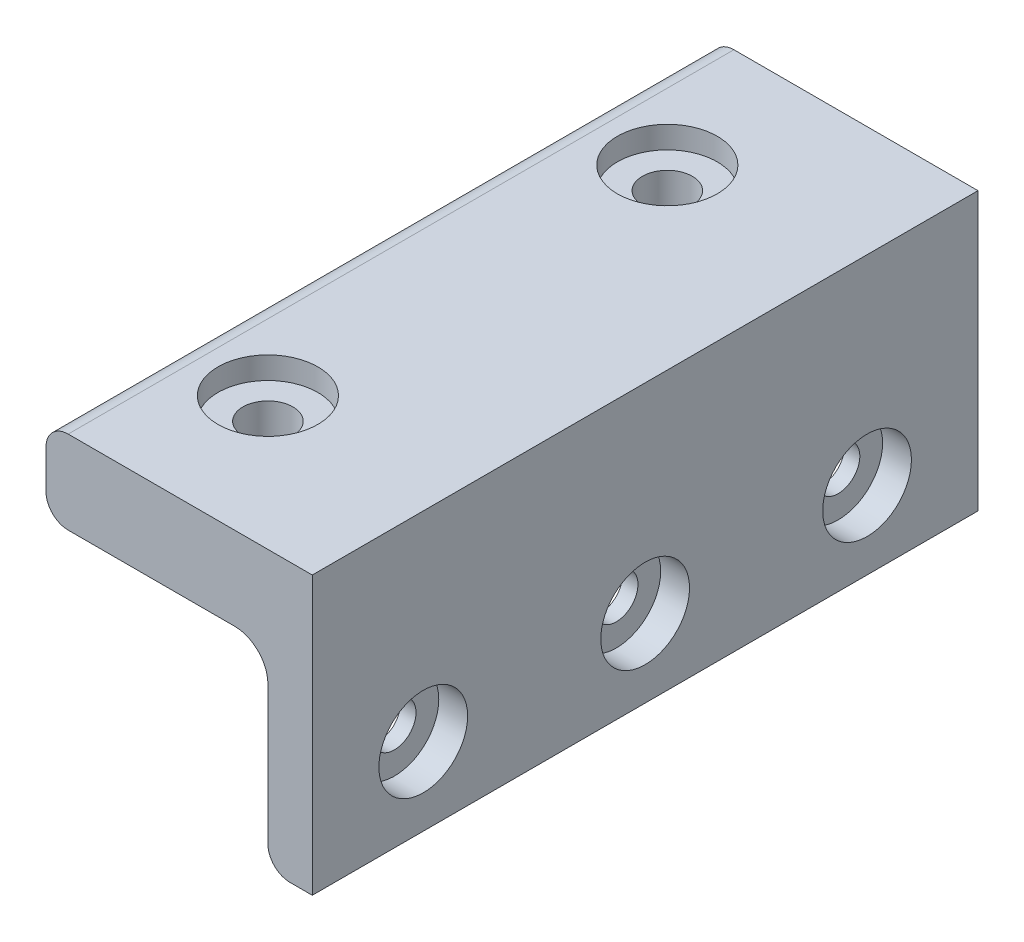
ISO-10303-21;
HEADER;
FILE_DESCRIPTION(('STEP AP214'),'2;1');
FILE_NAME('part.step','',(''),(''),'','','');
FILE_SCHEMA(('AUTOMOTIVE_DESIGN { 1 0 10303 214 1 1 1 1 }'));
ENDSEC;
DATA;
#1=APPLICATION_CONTEXT('core data for automotive mechanical design processes');
#2=APPLICATION_PROTOCOL_DEFINITION('international standard','automotive_design',2000,#1);
#3=PRODUCT_CONTEXT('',#1,'mechanical');
#4=PRODUCT('Part','Part','',(#3));
#5=PRODUCT_RELATED_PRODUCT_CATEGORY('part','',(#4));
#6=PRODUCT_DEFINITION_FORMATION('','',#4);
#7=PRODUCT_DEFINITION_CONTEXT('part definition',#1,'design');
#8=PRODUCT_DEFINITION('design','',#6,#7);
#9=PRODUCT_DEFINITION_SHAPE('','',#8);
#10=(LENGTH_UNIT() NAMED_UNIT(*) SI_UNIT(.MILLI.,.METRE.));
#11=(NAMED_UNIT(*) PLANE_ANGLE_UNIT() SI_UNIT($,.RADIAN.));
#12=(NAMED_UNIT(*) SI_UNIT($,.STERADIAN.) SOLID_ANGLE_UNIT());
#13=UNCERTAINTY_MEASURE_WITH_UNIT(LENGTH_MEASURE(1.E-05),#10,'distance_accuracy_value','');
#14=(GEOMETRIC_REPRESENTATION_CONTEXT(3) GLOBAL_UNCERTAINTY_ASSIGNED_CONTEXT((#13)) GLOBAL_UNIT_ASSIGNED_CONTEXT((#10,
#11,#12)) REPRESENTATION_CONTEXT('',''));
#15=CARTESIAN_POINT('',(0.,0.,0.));
#16=DIRECTION('',(0.,0.,1.));
#17=DIRECTION('',(1.,0.,0.));
#18=AXIS2_PLACEMENT_3D('',#15,#16,#17);
#19=CARTESIAN_POINT('',(0.,0.,-60.));
#20=DIRECTION('',(1.,0.,0.));
#21=DIRECTION('',(0.,1.,0.));
#22=AXIS2_PLACEMENT_3D('',#19,#20,#21);
#23=PLANE('',#22);
#24=CARTESIAN_POINT('',(0.,-18.,-50.));
#25=DIRECTION('',(1.,0.,0.));
#26=DIRECTION('',(0.,0.,-1.));
#27=AXIS2_PLACEMENT_3D('',#24,#25,#26);
#28=CIRCLE('',#27,4.);
#29=CARTESIAN_POINT('',(0.,-18.,-54.));
#30=VERTEX_POINT('',#29);
#31=EDGE_CURVE('E204',#30,#30,#28,.T.);
#32=ORIENTED_EDGE('',*,*,#31,.F.);
#33=EDGE_LOOP('',(#32));
#34=FACE_BOUND('',#33,.T.);
#35=CARTESIAN_POINT('',(0.,-18.,-30.));
#36=DIRECTION('',(1.,0.,0.));
#37=DIRECTION('',(0.,0.,-1.));
#38=AXIS2_PLACEMENT_3D('',#35,#36,#37);
#39=CIRCLE('',#38,4.);
#40=CARTESIAN_POINT('',(0.,-18.,-34.));
#41=VERTEX_POINT('',#40);
#42=EDGE_CURVE('E200',#41,#41,#39,.T.);
#43=ORIENTED_EDGE('',*,*,#42,.F.);
#44=EDGE_LOOP('',(#43));
#45=FACE_BOUND('',#44,.T.);
#46=CARTESIAN_POINT('',(0.,-18.,-10.));
#47=DIRECTION('',(1.,0.,0.));
#48=DIRECTION('',(0.,0.,-1.));
#49=AXIS2_PLACEMENT_3D('',#46,#47,#48);
#50=CIRCLE('',#49,4.);
#51=CARTESIAN_POINT('',(0.,-18.,-14.));
#52=VERTEX_POINT('',#51);
#53=EDGE_CURVE('E196',#52,#52,#50,.T.);
#54=ORIENTED_EDGE('',*,*,#53,.F.);
#55=EDGE_LOOP('',(#54));
#56=FACE_BOUND('',#55,.T.);
#57=DIRECTION('',(0.,1.,0.));
#58=VECTOR('',#57,1.);
#59=CARTESIAN_POINT('',(0.,0.,0.));
#60=LINE('',#59,#58);
#61=CARTESIAN_POINT('',(0.,-25.,0.));
#62=VERTEX_POINT('',#61);
#63=CARTESIAN_POINT('',(0.,0.,0.));
#64=VERTEX_POINT('',#63);
#65=EDGE_CURVE('E148',#62,#64,#60,.T.);
#66=ORIENTED_EDGE('',*,*,#65,.F.);
#67=DIRECTION('',(0.,0.,1.));
#68=VECTOR('',#67,1.);
#69=CARTESIAN_POINT('',(0.,-25.,-60.));
#70=LINE('',#69,#68);
#71=CARTESIAN_POINT('',(0.,-25.,-60.));
#72=VERTEX_POINT('',#71);
#73=EDGE_CURVE('E11',#72,#62,#70,.T.);
#74=ORIENTED_EDGE('',*,*,#73,.F.);
#75=DIRECTION('',(0.,1.,0.));
#76=VECTOR('',#75,1.);
#77=CARTESIAN_POINT('',(0.,0.,-60.));
#78=LINE('',#77,#76);
#79=CARTESIAN_POINT('',(0.,0.,-60.));
#80=VERTEX_POINT('',#79);
#81=EDGE_CURVE('E175',#72,#80,#78,.T.);
#82=ORIENTED_EDGE('',*,*,#81,.T.);
#83=DIRECTION('',(0.,0.,1.));
#84=VECTOR('',#83,1.);
#85=CARTESIAN_POINT('',(0.,0.,-60.));
#86=LINE('',#85,#84);
#87=EDGE_CURVE('E100',#80,#64,#86,.T.);
#88=ORIENTED_EDGE('',*,*,#87,.T.);
#89=EDGE_LOOP('',(#66,#74,#82,#88));
#90=FACE_BOUND('',#89,.T.);
#91=ADVANCED_FACE('F38',(#34,#45,#56,#90),#23,.T.);
#92=CARTESIAN_POINT('',(0.,-25.,-60.));
#93=DIRECTION('',(0.,-1.,0.));
#94=DIRECTION('',(0.,0.,-1.));
#95=AXIS2_PLACEMENT_3D('',#92,#93,#94);
#96=PLANE('',#95);
#97=DIRECTION('',(1.,0.,0.));
#98=VECTOR('',#97,1.);
#99=CARTESIAN_POINT('',(0.,-25.,0.));
#100=LINE('',#99,#98);
#101=CARTESIAN_POINT('',(-1.99999999999998,-25.,0.));
#102=VERTEX_POINT('',#101);
#103=EDGE_CURVE('E173',#102,#62,#100,.T.);
#104=ORIENTED_EDGE('',*,*,#103,.F.);
#105=DIRECTION('',(0.,0.,1.));
#106=VECTOR('',#105,1.);
#107=CARTESIAN_POINT('',(-1.99999999999998,-25.,-60.));
#108=LINE('',#107,#106);
#109=CARTESIAN_POINT('',(-1.99999999999998,-25.,-60.));
#110=VERTEX_POINT('',#109);
#111=EDGE_CURVE('E47',#110,#102,#108,.T.);
#112=ORIENTED_EDGE('',*,*,#111,.F.);
#113=DIRECTION('',(1.,0.,0.));
#114=VECTOR('',#113,1.);
#115=CARTESIAN_POINT('',(0.,-25.,-60.));
#116=LINE('',#115,#114);
#117=EDGE_CURVE('E138',#110,#72,#116,.T.);
#118=ORIENTED_EDGE('',*,*,#117,.T.);
#119=ORIENTED_EDGE('',*,*,#73,.T.);
#120=EDGE_LOOP('',(#104,#112,#118,#119));
#121=FACE_BOUND('',#120,.T.);
#122=ADVANCED_FACE('F271',(#121),#96,.T.);
#123=CARTESIAN_POINT('',(-2.,-23.,-60.));
#124=DIRECTION('',(0.,0.,1.));
#125=DIRECTION('',(1.,0.,0.));
#126=AXIS2_PLACEMENT_3D('',#123,#124,#125);
#127=CYLINDRICAL_SURFACE('',#126,2.);
#128=CARTESIAN_POINT('',(-2.,-23.,0.));
#129=DIRECTION('',(0.,0.,1.));
#130=DIRECTION('',(-1.,0.,0.));
#131=AXIS2_PLACEMENT_3D('',#128,#129,#130);
#132=CIRCLE('',#131,2.);
#133=CARTESIAN_POINT('',(-4.,-23.,0.));
#134=VERTEX_POINT('',#133);
#135=EDGE_CURVE('E125',#134,#102,#132,.T.);
#136=ORIENTED_EDGE('',*,*,#135,.F.);
#137=DIRECTION('',(0.,0.,1.));
#138=VECTOR('',#137,1.);
#139=CARTESIAN_POINT('',(-4.,-23.,-60.));
#140=LINE('',#139,#138);
#141=CARTESIAN_POINT('',(-4.,-23.,-60.));
#142=VERTEX_POINT('',#141);
#143=EDGE_CURVE('E120',#142,#134,#140,.T.);
#144=ORIENTED_EDGE('',*,*,#143,.F.);
#145=CARTESIAN_POINT('',(-2.,-23.,-60.));
#146=DIRECTION('',(0.,0.,1.));
#147=DIRECTION('',(-1.,0.,0.));
#148=AXIS2_PLACEMENT_3D('',#145,#146,#147);
#149=CIRCLE('',#148,2.);
#150=EDGE_CURVE('E123',#142,#110,#149,.T.);
#151=ORIENTED_EDGE('',*,*,#150,.T.);
#152=ORIENTED_EDGE('',*,*,#111,.T.);
#153=EDGE_LOOP('',(#136,#144,#151,#152));
#154=FACE_BOUND('',#153,.T.);
#155=ADVANCED_FACE('F122',(#154),#127,.T.);
#156=CARTESIAN_POINT('',(-4.,-23.,-60.));
#157=DIRECTION('',(-1.,0.,0.));
#158=DIRECTION('',(0.,0.,1.));
#159=AXIS2_PLACEMENT_3D('',#156,#157,#158);
#160=PLANE('',#159);
#161=CARTESIAN_POINT('',(-4.,-18.,-50.));
#162=DIRECTION('',(-1.,0.,0.));
#163=DIRECTION('',(0.,0.,1.));
#164=AXIS2_PLACEMENT_3D('',#161,#162,#163);
#165=CIRCLE('',#164,1.95);
#166=CARTESIAN_POINT('',(-4.,-18.,-48.05));
#167=VERTEX_POINT('',#166);
#168=EDGE_CURVE('E198',#167,#167,#165,.T.);
#169=ORIENTED_EDGE('',*,*,#168,.F.);
#170=EDGE_LOOP('',(#169));
#171=FACE_BOUND('',#170,.T.);
#172=CARTESIAN_POINT('',(-4.,-18.,-30.));
#173=DIRECTION('',(-1.,0.,0.));
#174=DIRECTION('',(0.,0.,1.));
#175=AXIS2_PLACEMENT_3D('',#172,#173,#174);
#176=CIRCLE('',#175,1.95);
#177=CARTESIAN_POINT('',(-4.,-18.,-28.05));
#178=VERTEX_POINT('',#177);
#179=EDGE_CURVE('E193',#178,#178,#176,.T.);
#180=ORIENTED_EDGE('',*,*,#179,.F.);
#181=EDGE_LOOP('',(#180));
#182=FACE_BOUND('',#181,.T.);
#183=CARTESIAN_POINT('',(-4.,-18.,-10.));
#184=DIRECTION('',(-1.,0.,0.));
#185=DIRECTION('',(0.,0.,1.));
#186=AXIS2_PLACEMENT_3D('',#183,#184,#185);
#187=CIRCLE('',#186,1.95);
#188=CARTESIAN_POINT('',(-4.,-18.,-8.05));
#189=VERTEX_POINT('',#188);
#190=EDGE_CURVE('E152',#189,#189,#187,.T.);
#191=ORIENTED_EDGE('',*,*,#190,.F.);
#192=EDGE_LOOP('',(#191));
#193=FACE_BOUND('',#192,.T.);
#194=DIRECTION('',(0.,-1.,0.));
#195=VECTOR('',#194,1.);
#196=CARTESIAN_POINT('',(-4.,-23.,0.));
#197=LINE('',#196,#195);
#198=CARTESIAN_POINT('',(-4.,-10.5,0.));
#199=VERTEX_POINT('',#198);
#200=EDGE_CURVE('E170',#199,#134,#197,.T.);
#201=ORIENTED_EDGE('',*,*,#200,.F.);
#202=DIRECTION('',(0.,0.,1.));
#203=VECTOR('',#202,1.);
#204=CARTESIAN_POINT('',(-4.,-10.5,-60.));
#205=LINE('',#204,#203);
#206=CARTESIAN_POINT('',(-4.,-10.5,-60.));
#207=VERTEX_POINT('',#206);
#208=EDGE_CURVE('E130',#207,#199,#205,.T.);
#209=ORIENTED_EDGE('',*,*,#208,.F.);
#210=DIRECTION('',(0.,-1.,0.));
#211=VECTOR('',#210,1.);
#212=CARTESIAN_POINT('',(-4.,-23.,-60.));
#213=LINE('',#212,#211);
#214=EDGE_CURVE('E136',#207,#142,#213,.T.);
#215=ORIENTED_EDGE('',*,*,#214,.T.);
#216=ORIENTED_EDGE('',*,*,#143,.T.);
#217=EDGE_LOOP('',(#201,#209,#215,#216));
#218=FACE_BOUND('',#217,.T.);
#219=ADVANCED_FACE('F140',(#171,#182,#193,#218),#160,.T.);
#220=CARTESIAN_POINT('',(-7.,-10.5,-60.));
#221=DIRECTION('',(0.,0.,1.));
#222=DIRECTION('',(1.,0.,0.));
#223=AXIS2_PLACEMENT_3D('',#220,#221,#222);
#224=CYLINDRICAL_SURFACE('',#223,3.);
#225=CARTESIAN_POINT('',(-7.,-10.5,0.));
#226=DIRECTION('',(0.,0.,-1.));
#227=DIRECTION('',(1.,0.,0.));
#228=AXIS2_PLACEMENT_3D('',#225,#226,#227);
#229=CIRCLE('',#228,3.);
#230=CARTESIAN_POINT('',(-7.00000000000002,-7.5,0.));
#231=VERTEX_POINT('',#230);
#232=EDGE_CURVE('E167',#231,#199,#229,.T.);
#233=ORIENTED_EDGE('',*,*,#232,.F.);
#234=DIRECTION('',(0.,0.,1.));
#235=VECTOR('',#234,1.);
#236=CARTESIAN_POINT('',(-7.00000000000002,-7.5,-60.));
#237=LINE('',#236,#235);
#238=CARTESIAN_POINT('',(-7.00000000000002,-7.5,-60.));
#239=VERTEX_POINT('',#238);
#240=EDGE_CURVE('E179',#239,#231,#237,.T.);
#241=ORIENTED_EDGE('',*,*,#240,.F.);
#242=CARTESIAN_POINT('',(-7.,-10.5,-60.));
#243=DIRECTION('',(0.,0.,-1.));
#244=DIRECTION('',(1.,0.,0.));
#245=AXIS2_PLACEMENT_3D('',#242,#243,#244);
#246=CIRCLE('',#245,3.);
#247=EDGE_CURVE('E141',#239,#207,#246,.T.);
#248=ORIENTED_EDGE('',*,*,#247,.T.);
#249=ORIENTED_EDGE('',*,*,#208,.T.);
#250=EDGE_LOOP('',(#233,#241,#248,#249));
#251=FACE_BOUND('',#250,.T.);
#252=ADVANCED_FACE('F285',(#251),#224,.F.);
#253=CARTESIAN_POINT('',(-7.00000000000002,-7.5,-60.));
#254=DIRECTION('',(0.,-1.,0.));
#255=DIRECTION('',(1.,0.,0.));
#256=AXIS2_PLACEMENT_3D('',#253,#254,#255);
#257=PLANE('',#256);
#258=CARTESIAN_POINT('',(-16.,-7.5,-48.));
#259=DIRECTION('',(0.,-1.,0.));
#260=DIRECTION('',(1.,0.,0.));
#261=AXIS2_PLACEMENT_3D('',#258,#259,#260);
#262=CIRCLE('',#261,2.25);
#263=CARTESIAN_POINT('',(-13.75,-7.5,-48.));
#264=VERTEX_POINT('',#263);
#265=EDGE_CURVE('E41',#264,#264,#262,.T.);
#266=ORIENTED_EDGE('',*,*,#265,.F.);
#267=EDGE_LOOP('',(#266));
#268=FACE_BOUND('',#267,.T.);
#269=CARTESIAN_POINT('',(-16.,-7.5,-12.));
#270=DIRECTION('',(0.,-1.,0.));
#271=DIRECTION('',(1.,0.,0.));
#272=AXIS2_PLACEMENT_3D('',#269,#270,#271);
#273=CIRCLE('',#272,2.25);
#274=CARTESIAN_POINT('',(-13.75,-7.5,-12.));
#275=VERTEX_POINT('',#274);
#276=EDGE_CURVE('E202',#275,#275,#273,.T.);
#277=ORIENTED_EDGE('',*,*,#276,.F.);
#278=EDGE_LOOP('',(#277));
#279=FACE_BOUND('',#278,.T.);
#280=DIRECTION('',(1.,0.,0.));
#281=VECTOR('',#280,1.);
#282=CARTESIAN_POINT('',(-7.00000000000002,-7.5,0.));
#283=LINE('',#282,#281);
#284=CARTESIAN_POINT('',(-22.,-7.5,0.));
#285=VERTEX_POINT('',#284);
#286=EDGE_CURVE('E164',#285,#231,#283,.T.);
#287=ORIENTED_EDGE('',*,*,#286,.F.);
#288=DIRECTION('',(0.,0.,1.));
#289=VECTOR('',#288,1.);
#290=CARTESIAN_POINT('',(-22.,-7.5,-60.));
#291=LINE('',#290,#289);
#292=CARTESIAN_POINT('',(-22.,-7.5,-60.));
#293=VERTEX_POINT('',#292);
#294=EDGE_CURVE('E181',#293,#285,#291,.T.);
#295=ORIENTED_EDGE('',*,*,#294,.F.);
#296=DIRECTION('',(1.,0.,0.));
#297=VECTOR('',#296,1.);
#298=CARTESIAN_POINT('',(-7.00000000000002,-7.5,-60.));
#299=LINE('',#298,#297);
#300=EDGE_CURVE('E143',#293,#239,#299,.T.);
#301=ORIENTED_EDGE('',*,*,#300,.T.);
#302=ORIENTED_EDGE('',*,*,#240,.T.);
#303=EDGE_LOOP('',(#287,#295,#301,#302));
#304=FACE_BOUND('',#303,.T.);
#305=ADVANCED_FACE('F254',(#268,#279,#304),#257,.T.);
#306=CARTESIAN_POINT('',(-22.,-5.5,-60.));
#307=DIRECTION('',(0.,0.,1.));
#308=DIRECTION('',(1.,0.,0.));
#309=AXIS2_PLACEMENT_3D('',#306,#307,#308);
#310=CYLINDRICAL_SURFACE('',#309,2.);
#311=CARTESIAN_POINT('',(-22.,-5.5,0.));
#312=DIRECTION('',(0.,0.,1.));
#313=DIRECTION('',(-1.,0.,0.));
#314=AXIS2_PLACEMENT_3D('',#311,#312,#313);
#315=CIRCLE('',#314,2.);
#316=CARTESIAN_POINT('',(-24.,-5.49999999999999,0.));
#317=VERTEX_POINT('',#316);
#318=EDGE_CURVE('E161',#317,#285,#315,.T.);
#319=ORIENTED_EDGE('',*,*,#318,.F.);
#320=DIRECTION('',(0.,0.,1.));
#321=VECTOR('',#320,1.);
#322=CARTESIAN_POINT('',(-24.,-5.49999999999999,-60.));
#323=LINE('',#322,#321);
#324=CARTESIAN_POINT('',(-24.,-5.49999999999999,-60.));
#325=VERTEX_POINT('',#324);
#326=EDGE_CURVE('E183',#325,#317,#323,.T.);
#327=ORIENTED_EDGE('',*,*,#326,.F.);
#328=CARTESIAN_POINT('',(-22.,-5.5,-60.));
#329=DIRECTION('',(0.,0.,1.));
#330=DIRECTION('',(-1.,0.,0.));
#331=AXIS2_PLACEMENT_3D('',#328,#329,#330);
#332=CIRCLE('',#331,2.);
#333=EDGE_CURVE('E248',#325,#293,#332,.T.);
#334=ORIENTED_EDGE('',*,*,#333,.T.);
#335=ORIENTED_EDGE('',*,*,#294,.T.);
#336=EDGE_LOOP('',(#319,#327,#334,#335));
#337=FACE_BOUND('',#336,.T.);
#338=ADVANCED_FACE('F260',(#337),#310,.T.);
#339=CARTESIAN_POINT('',(-24.,-5.49999999999999,-60.));
#340=DIRECTION('',(-1.,0.,0.));
#341=DIRECTION('',(0.,0.,1.));
#342=AXIS2_PLACEMENT_3D('',#339,#340,#341);
#343=PLANE('',#342);
#344=DIRECTION('',(0.,-1.,0.));
#345=VECTOR('',#344,1.);
#346=CARTESIAN_POINT('',(-24.,-5.49999999999999,0.));
#347=LINE('',#346,#345);
#348=CARTESIAN_POINT('',(-24.,-2.00000000000001,0.));
#349=VERTEX_POINT('',#348);
#350=EDGE_CURVE('E158',#349,#317,#347,.T.);
#351=ORIENTED_EDGE('',*,*,#350,.F.);
#352=DIRECTION('',(0.,0.,1.));
#353=VECTOR('',#352,1.);
#354=CARTESIAN_POINT('',(-24.,-2.00000000000001,-60.));
#355=LINE('',#354,#353);
#356=CARTESIAN_POINT('',(-24.,-2.00000000000001,-60.));
#357=VERTEX_POINT('',#356);
#358=EDGE_CURVE('E185',#357,#349,#355,.T.);
#359=ORIENTED_EDGE('',*,*,#358,.F.);
#360=DIRECTION('',(0.,-1.,0.));
#361=VECTOR('',#360,1.);
#362=CARTESIAN_POINT('',(-24.,-5.49999999999999,-60.));
#363=LINE('',#362,#361);
#364=EDGE_CURVE('E245',#357,#325,#363,.T.);
#365=ORIENTED_EDGE('',*,*,#364,.T.);
#366=ORIENTED_EDGE('',*,*,#326,.T.);
#367=EDGE_LOOP('',(#351,#359,#365,#366));
#368=FACE_BOUND('',#367,.T.);
#369=ADVANCED_FACE('F263',(#368),#343,.T.);
#370=CARTESIAN_POINT('',(-22.,-2.,-60.));
#371=DIRECTION('',(0.,0.,1.));
#372=DIRECTION('',(1.,0.,0.));
#373=AXIS2_PLACEMENT_3D('',#370,#371,#372);
#374=CYLINDRICAL_SURFACE('',#373,2.);
#375=CARTESIAN_POINT('',(-22.,-2.,0.));
#376=DIRECTION('',(0.,0.,1.));
#377=DIRECTION('',(1.,0.,0.));
#378=AXIS2_PLACEMENT_3D('',#375,#376,#377);
#379=CIRCLE('',#378,2.);
#380=CARTESIAN_POINT('',(-22.,0.,0.));
#381=VERTEX_POINT('',#380);
#382=EDGE_CURVE('E155',#381,#349,#379,.T.);
#383=ORIENTED_EDGE('',*,*,#382,.F.);
#384=DIRECTION('',(0.,0.,1.));
#385=VECTOR('',#384,1.);
#386=CARTESIAN_POINT('',(-22.,0.,-60.));
#387=LINE('',#386,#385);
#388=CARTESIAN_POINT('',(-22.,0.,-60.));
#389=VERTEX_POINT('',#388);
#390=EDGE_CURVE('E187',#389,#381,#387,.T.);
#391=ORIENTED_EDGE('',*,*,#390,.F.);
#392=CARTESIAN_POINT('',(-22.,-2.,-60.));
#393=DIRECTION('',(0.,0.,1.));
#394=DIRECTION('',(1.,0.,0.));
#395=AXIS2_PLACEMENT_3D('',#392,#393,#394);
#396=CIRCLE('',#395,2.);
#397=EDGE_CURVE('E242',#389,#357,#396,.T.);
#398=ORIENTED_EDGE('',*,*,#397,.T.);
#399=ORIENTED_EDGE('',*,*,#358,.T.);
#400=EDGE_LOOP('',(#383,#391,#398,#399));
#401=FACE_BOUND('',#400,.T.);
#402=ADVANCED_FACE('F267',(#401),#374,.T.);
#403=CARTESIAN_POINT('',(-22.,0.,-60.));
#404=DIRECTION('',(0.,1.,0.));
#405=DIRECTION('',(0.,0.,1.));
#406=AXIS2_PLACEMENT_3D('',#403,#404,#405);
#407=PLANE('',#406);
#408=CARTESIAN_POINT('',(-16.,0.,-48.));
#409=DIRECTION('',(0.,1.,0.));
#410=DIRECTION('',(0.,0.,1.));
#411=AXIS2_PLACEMENT_3D('',#408,#409,#410);
#412=CIRCLE('',#411,4.5);
#413=CARTESIAN_POINT('',(-16.,0.,-43.5));
#414=VERTEX_POINT('',#413);
#415=EDGE_CURVE('E306',#414,#414,#412,.T.);
#416=ORIENTED_EDGE('',*,*,#415,.F.);
#417=EDGE_LOOP('',(#416));
#418=FACE_BOUND('',#417,.T.);
#419=CARTESIAN_POINT('',(-16.,0.,-12.));
#420=DIRECTION('',(0.,1.,0.));
#421=DIRECTION('',(0.,0.,1.));
#422=AXIS2_PLACEMENT_3D('',#419,#420,#421);
#423=CIRCLE('',#422,4.5);
#424=CARTESIAN_POINT('',(-16.,0.,-7.5));
#425=VERTEX_POINT('',#424);
#426=EDGE_CURVE('E217',#425,#425,#423,.T.);
#427=ORIENTED_EDGE('',*,*,#426,.F.);
#428=EDGE_LOOP('',(#427));
#429=FACE_BOUND('',#428,.T.);
#430=DIRECTION('',(-1.,0.,0.));
#431=VECTOR('',#430,1.);
#432=CARTESIAN_POINT('',(-22.,0.,0.));
#433=LINE('',#432,#431);
#434=EDGE_CURVE('E151',#64,#381,#433,.T.);
#435=ORIENTED_EDGE('',*,*,#434,.F.);
#436=ORIENTED_EDGE('',*,*,#87,.F.);
#437=DIRECTION('',(-1.,0.,0.));
#438=VECTOR('',#437,1.);
#439=CARTESIAN_POINT('',(-22.,0.,-60.));
#440=LINE('',#439,#438);
#441=EDGE_CURVE('E240',#80,#389,#440,.T.);
#442=ORIENTED_EDGE('',*,*,#441,.T.);
#443=ORIENTED_EDGE('',*,*,#390,.T.);
#444=EDGE_LOOP('',(#435,#436,#442,#443));
#445=FACE_BOUND('',#444,.T.);
#446=ADVANCED_FACE('F268',(#418,#429,#445),#407,.T.);
#447=CARTESIAN_POINT('',(-2.,-23.,-60.));
#448=DIRECTION('',(0.,0.,-1.));
#449=DIRECTION('',(-1.,0.,0.));
#450=AXIS2_PLACEMENT_3D('',#447,#448,#449);
#451=PLANE('',#450);
#452=ORIENTED_EDGE('',*,*,#81,.F.);
#453=ORIENTED_EDGE('',*,*,#117,.F.);
#454=ORIENTED_EDGE('',*,*,#150,.F.);
#455=ORIENTED_EDGE('',*,*,#214,.F.);
#456=ORIENTED_EDGE('',*,*,#247,.F.);
#457=ORIENTED_EDGE('',*,*,#300,.F.);
#458=ORIENTED_EDGE('',*,*,#333,.F.);
#459=ORIENTED_EDGE('',*,*,#364,.F.);
#460=ORIENTED_EDGE('',*,*,#397,.F.);
#461=ORIENTED_EDGE('',*,*,#441,.F.);
#462=EDGE_LOOP('',(#452,#453,#454,#455,#456,#457,#458,#459,#460,#461));
#463=FACE_BOUND('',#462,.T.);
#464=ADVANCED_FACE('F134',(#463),#451,.T.);
#465=CARTESIAN_POINT('',(-2.,-23.,0.));
#466=DIRECTION('',(0.,0.,-1.));
#467=DIRECTION('',(-1.,0.,0.));
#468=AXIS2_PLACEMENT_3D('',#465,#466,#467);
#469=PLANE('',#468);
#470=ORIENTED_EDGE('',*,*,#65,.T.);
#471=ORIENTED_EDGE('',*,*,#434,.T.);
#472=ORIENTED_EDGE('',*,*,#382,.T.);
#473=ORIENTED_EDGE('',*,*,#350,.T.);
#474=ORIENTED_EDGE('',*,*,#318,.T.);
#475=ORIENTED_EDGE('',*,*,#286,.T.);
#476=ORIENTED_EDGE('',*,*,#232,.T.);
#477=ORIENTED_EDGE('',*,*,#200,.T.);
#478=ORIENTED_EDGE('',*,*,#135,.T.);
#479=ORIENTED_EDGE('',*,*,#103,.T.);
#480=EDGE_LOOP('',(#470,#471,#472,#473,#474,#475,#476,#477,#478,#479));
#481=FACE_BOUND('',#480,.T.);
#482=ADVANCED_FACE('F270',(#481),#469,.F.);
#483=CARTESIAN_POINT('',(0.,-18.,-10.));
#484=DIRECTION('',(1.,0.,0.));
#485=DIRECTION('',(0.,0.,-1.));
#486=AXIS2_PLACEMENT_3D('',#483,#484,#485);
#487=CYLINDRICAL_SURFACE('',#486,1.95);
#488=ORIENTED_EDGE('',*,*,#190,.T.);
#489=EDGE_LOOP('',(#488));
#490=FACE_BOUND('',#489,.T.);
#491=CARTESIAN_POINT('',(-2.6,-18.,-10.));
#492=DIRECTION('',(1.,0.,0.));
#493=DIRECTION('',(0.,0.,-1.));
#494=AXIS2_PLACEMENT_3D('',#491,#492,#493);
#495=CIRCLE('',#494,1.95);
#496=CARTESIAN_POINT('',(-2.6,-18.,-11.95));
#497=VERTEX_POINT('',#496);
#498=EDGE_CURVE('E192',#497,#497,#495,.T.);
#499=ORIENTED_EDGE('',*,*,#498,.T.);
#500=EDGE_LOOP('',(#499));
#501=FACE_BOUND('',#500,.T.);
#502=ADVANCED_FACE('F377',(#490,#501),#487,.F.);
#503=CARTESIAN_POINT('',(-2.6,-16.05,-10.));
#504=DIRECTION('',(-1.,0.,0.));
#505=DIRECTION('',(0.,0.,1.));
#506=AXIS2_PLACEMENT_3D('',#503,#504,#505);
#507=PLANE('',#506);
#508=ORIENTED_EDGE('',*,*,#498,.F.);
#509=EDGE_LOOP('',(#508));
#510=FACE_BOUND('',#509,.T.);
#511=CARTESIAN_POINT('',(-2.6,-18.,-10.));
#512=DIRECTION('',(1.,0.,0.));
#513=DIRECTION('',(0.,0.,-1.));
#514=AXIS2_PLACEMENT_3D('',#511,#512,#513);
#515=CIRCLE('',#514,4.);
#516=CARTESIAN_POINT('',(-2.6,-18.,-14.));
#517=VERTEX_POINT('',#516);
#518=EDGE_CURVE('E234',#517,#517,#515,.T.);
#519=ORIENTED_EDGE('',*,*,#518,.T.);
#520=EDGE_LOOP('',(#519));
#521=FACE_BOUND('',#520,.T.);
#522=ADVANCED_FACE('F373',(#510,#521),#507,.F.);
#523=CARTESIAN_POINT('',(0.,-18.,-10.));
#524=DIRECTION('',(1.,0.,0.));
#525=DIRECTION('',(0.,0.,-1.));
#526=AXIS2_PLACEMENT_3D('',#523,#524,#525);
#527=CYLINDRICAL_SURFACE('',#526,4.);
#528=ORIENTED_EDGE('',*,*,#518,.F.);
#529=EDGE_LOOP('',(#528));
#530=FACE_BOUND('',#529,.T.);
#531=ORIENTED_EDGE('',*,*,#53,.T.);
#532=EDGE_LOOP('',(#531));
#533=FACE_BOUND('',#532,.T.);
#534=ADVANCED_FACE('F369',(#530,#533),#527,.F.);
#535=CARTESIAN_POINT('',(0.,-18.,-30.));
#536=DIRECTION('',(1.,0.,0.));
#537=DIRECTION('',(0.,0.,-1.));
#538=AXIS2_PLACEMENT_3D('',#535,#536,#537);
#539=CYLINDRICAL_SURFACE('',#538,1.95);
#540=ORIENTED_EDGE('',*,*,#179,.T.);
#541=EDGE_LOOP('',(#540));
#542=FACE_BOUND('',#541,.T.);
#543=CARTESIAN_POINT('',(-2.6,-18.,-30.));
#544=DIRECTION('',(1.,0.,0.));
#545=DIRECTION('',(0.,0.,-1.));
#546=AXIS2_PLACEMENT_3D('',#543,#544,#545);
#547=CIRCLE('',#546,1.95);
#548=CARTESIAN_POINT('',(-2.6,-18.,-31.95));
#549=VERTEX_POINT('',#548);
#550=EDGE_CURVE('E197',#549,#549,#547,.T.);
#551=ORIENTED_EDGE('',*,*,#550,.T.);
#552=EDGE_LOOP('',(#551));
#553=FACE_BOUND('',#552,.T.);
#554=ADVANCED_FACE('F365',(#542,#553),#539,.F.);
#555=CARTESIAN_POINT('',(-2.6,-16.05,-30.));
#556=DIRECTION('',(-1.,0.,0.));
#557=DIRECTION('',(0.,0.,1.));
#558=AXIS2_PLACEMENT_3D('',#555,#556,#557);
#559=PLANE('',#558);
#560=ORIENTED_EDGE('',*,*,#550,.F.);
#561=EDGE_LOOP('',(#560));
#562=FACE_BOUND('',#561,.T.);
#563=CARTESIAN_POINT('',(-2.6,-18.,-30.));
#564=DIRECTION('',(1.,0.,0.));
#565=DIRECTION('',(0.,0.,-1.));
#566=AXIS2_PLACEMENT_3D('',#563,#564,#565);
#567=CIRCLE('',#566,4.);
#568=CARTESIAN_POINT('',(-2.6,-18.,-34.));
#569=VERTEX_POINT('',#568);
#570=EDGE_CURVE('E227',#569,#569,#567,.T.);
#571=ORIENTED_EDGE('',*,*,#570,.T.);
#572=EDGE_LOOP('',(#571));
#573=FACE_BOUND('',#572,.T.);
#574=ADVANCED_FACE('F361',(#562,#573),#559,.F.);
#575=CARTESIAN_POINT('',(0.,-18.,-30.));
#576=DIRECTION('',(1.,0.,0.));
#577=DIRECTION('',(0.,0.,-1.));
#578=AXIS2_PLACEMENT_3D('',#575,#576,#577);
#579=CYLINDRICAL_SURFACE('',#578,4.);
#580=ORIENTED_EDGE('',*,*,#570,.F.);
#581=EDGE_LOOP('',(#580));
#582=FACE_BOUND('',#581,.T.);
#583=ORIENTED_EDGE('',*,*,#42,.T.);
#584=EDGE_LOOP('',(#583));
#585=FACE_BOUND('',#584,.T.);
#586=ADVANCED_FACE('F357',(#582,#585),#579,.F.);
#587=CARTESIAN_POINT('',(0.,-18.,-50.));
#588=DIRECTION('',(1.,0.,0.));
#589=DIRECTION('',(0.,0.,-1.));
#590=AXIS2_PLACEMENT_3D('',#587,#588,#589);
#591=CYLINDRICAL_SURFACE('',#590,1.95);
#592=ORIENTED_EDGE('',*,*,#168,.T.);
#593=EDGE_LOOP('',(#592));
#594=FACE_BOUND('',#593,.T.);
#595=CARTESIAN_POINT('',(-2.6,-18.,-50.));
#596=DIRECTION('',(1.,0.,0.));
#597=DIRECTION('',(0.,0.,-1.));
#598=AXIS2_PLACEMENT_3D('',#595,#596,#597);
#599=CIRCLE('',#598,1.95);
#600=CARTESIAN_POINT('',(-2.6,-18.,-51.95));
#601=VERTEX_POINT('',#600);
#602=EDGE_CURVE('E201',#601,#601,#599,.T.);
#603=ORIENTED_EDGE('',*,*,#602,.T.);
#604=EDGE_LOOP('',(#603));
#605=FACE_BOUND('',#604,.T.);
#606=ADVANCED_FACE('F353',(#594,#605),#591,.F.);
#607=CARTESIAN_POINT('',(-2.6,-16.05,-50.));
#608=DIRECTION('',(-1.,0.,0.));
#609=DIRECTION('',(0.,0.,1.));
#610=AXIS2_PLACEMENT_3D('',#607,#608,#609);
#611=PLANE('',#610);
#612=ORIENTED_EDGE('',*,*,#602,.F.);
#613=EDGE_LOOP('',(#612));
#614=FACE_BOUND('',#613,.T.);
#615=CARTESIAN_POINT('',(-2.6,-18.,-50.));
#616=DIRECTION('',(1.,0.,0.));
#617=DIRECTION('',(0.,0.,-1.));
#618=AXIS2_PLACEMENT_3D('',#615,#616,#617);
#619=CIRCLE('',#618,4.);
#620=CARTESIAN_POINT('',(-2.6,-18.,-54.));
#621=VERTEX_POINT('',#620);
#622=EDGE_CURVE('E209',#621,#621,#619,.T.);
#623=ORIENTED_EDGE('',*,*,#622,.T.);
#624=EDGE_LOOP('',(#623));
#625=FACE_BOUND('',#624,.T.);
#626=ADVANCED_FACE('F349',(#614,#625),#611,.F.);
#627=CARTESIAN_POINT('',(0.,-18.,-50.));
#628=DIRECTION('',(1.,0.,0.));
#629=DIRECTION('',(0.,0.,-1.));
#630=AXIS2_PLACEMENT_3D('',#627,#628,#629);
#631=CYLINDRICAL_SURFACE('',#630,4.);
#632=ORIENTED_EDGE('',*,*,#622,.F.);
#633=EDGE_LOOP('',(#632));
#634=FACE_BOUND('',#633,.T.);
#635=ORIENTED_EDGE('',*,*,#31,.T.);
#636=EDGE_LOOP('',(#635));
#637=FACE_BOUND('',#636,.T.);
#638=ADVANCED_FACE('F346',(#634,#637),#631,.F.);
#639=CARTESIAN_POINT('',(-16.,0.,-12.));
#640=DIRECTION('',(0.,1.,0.));
#641=DIRECTION('',(0.,0.,1.));
#642=AXIS2_PLACEMENT_3D('',#639,#640,#641);
#643=CYLINDRICAL_SURFACE('',#642,2.25);
#644=ORIENTED_EDGE('',*,*,#276,.T.);
#645=EDGE_LOOP('',(#644));
#646=FACE_BOUND('',#645,.T.);
#647=CARTESIAN_POINT('',(-16.,-2.,-12.));
#648=DIRECTION('',(0.,1.,0.));
#649=DIRECTION('',(0.,0.,1.));
#650=AXIS2_PLACEMENT_3D('',#647,#648,#649);
#651=CIRCLE('',#650,2.25);
#652=CARTESIAN_POINT('',(-16.,-2.,-9.75));
#653=VERTEX_POINT('',#652);
#654=EDGE_CURVE('E205',#653,#653,#651,.T.);
#655=ORIENTED_EDGE('',*,*,#654,.T.);
#656=EDGE_LOOP('',(#655));
#657=FACE_BOUND('',#656,.T.);
#658=ADVANCED_FACE('F342',(#646,#657),#643,.F.);
#659=CARTESIAN_POINT('',(-13.75,-2.,-12.));
#660=DIRECTION('',(0.,-1.,0.));
#661=DIRECTION('',(0.,0.,-1.));
#662=AXIS2_PLACEMENT_3D('',#659,#660,#661);
#663=PLANE('',#662);
#664=ORIENTED_EDGE('',*,*,#654,.F.);
#665=EDGE_LOOP('',(#664));
#666=FACE_BOUND('',#665,.T.);
#667=CARTESIAN_POINT('',(-16.,-2.,-12.));
#668=DIRECTION('',(0.,1.,0.));
#669=DIRECTION('',(0.,0.,1.));
#670=AXIS2_PLACEMENT_3D('',#667,#668,#669);
#671=CIRCLE('',#670,4.5);
#672=CARTESIAN_POINT('',(-16.,-2.,-7.5));
#673=VERTEX_POINT('',#672);
#674=EDGE_CURVE('E212',#673,#673,#671,.T.);
#675=ORIENTED_EDGE('',*,*,#674,.T.);
#676=EDGE_LOOP('',(#675));
#677=FACE_BOUND('',#676,.T.);
#678=ADVANCED_FACE('F338',(#666,#677),#663,.F.);
#679=CARTESIAN_POINT('',(-16.,0.,-12.));
#680=DIRECTION('',(0.,1.,0.));
#681=DIRECTION('',(0.,0.,1.));
#682=AXIS2_PLACEMENT_3D('',#679,#680,#681);
#683=CYLINDRICAL_SURFACE('',#682,4.5);
#684=ORIENTED_EDGE('',*,*,#674,.F.);
#685=EDGE_LOOP('',(#684));
#686=FACE_BOUND('',#685,.T.);
#687=ORIENTED_EDGE('',*,*,#426,.T.);
#688=EDGE_LOOP('',(#687));
#689=FACE_BOUND('',#688,.T.);
#690=ADVANCED_FACE('F334',(#686,#689),#683,.F.);
#691=CARTESIAN_POINT('',(-16.,0.,-48.));
#692=DIRECTION('',(0.,1.,0.));
#693=DIRECTION('',(0.,0.,1.));
#694=AXIS2_PLACEMENT_3D('',#691,#692,#693);
#695=CYLINDRICAL_SURFACE('',#694,2.25);
#696=ORIENTED_EDGE('',*,*,#265,.T.);
#697=EDGE_LOOP('',(#696));
#698=FACE_BOUND('',#697,.T.);
#699=CARTESIAN_POINT('',(-16.,-2.,-48.));
#700=DIRECTION('',(0.,1.,0.));
#701=DIRECTION('',(0.,0.,1.));
#702=AXIS2_PLACEMENT_3D('',#699,#700,#701);
#703=CIRCLE('',#702,2.25);
#704=CARTESIAN_POINT('',(-16.,-2.,-45.75));
#705=VERTEX_POINT('',#704);
#706=EDGE_CURVE('E311',#705,#705,#703,.T.);
#707=ORIENTED_EDGE('',*,*,#706,.T.);
#708=EDGE_LOOP('',(#707));
#709=FACE_BOUND('',#708,.T.);
#710=ADVANCED_FACE('F327',(#698,#709),#695,.F.);
#711=CARTESIAN_POINT('',(-13.75,-2.,-48.));
#712=DIRECTION('',(0.,-1.,0.));
#713=DIRECTION('',(0.,0.,-1.));
#714=AXIS2_PLACEMENT_3D('',#711,#712,#713);
#715=PLANE('',#714);
#716=ORIENTED_EDGE('',*,*,#706,.F.);
#717=EDGE_LOOP('',(#716));
#718=FACE_BOUND('',#717,.T.);
#719=CARTESIAN_POINT('',(-16.,-2.,-48.));
#720=DIRECTION('',(0.,1.,0.));
#721=DIRECTION('',(0.,0.,1.));
#722=AXIS2_PLACEMENT_3D('',#719,#720,#721);
#723=CIRCLE('',#722,4.5);
#724=CARTESIAN_POINT('',(-16.,-2.,-43.5));
#725=VERTEX_POINT('',#724);
#726=EDGE_CURVE('E315',#725,#725,#723,.T.);
#727=ORIENTED_EDGE('',*,*,#726,.T.);
#728=EDGE_LOOP('',(#727));
#729=FACE_BOUND('',#728,.T.);
#730=ADVANCED_FACE('F321',(#718,#729),#715,.F.);
#731=CARTESIAN_POINT('',(-16.,0.,-48.));
#732=DIRECTION('',(0.,1.,0.));
#733=DIRECTION('',(0.,0.,1.));
#734=AXIS2_PLACEMENT_3D('',#731,#732,#733);
#735=CYLINDRICAL_SURFACE('',#734,4.5);
#736=ORIENTED_EDGE('',*,*,#726,.F.);
#737=EDGE_LOOP('',(#736));
#738=FACE_BOUND('',#737,.T.);
#739=ORIENTED_EDGE('',*,*,#415,.T.);
#740=EDGE_LOOP('',(#739));
#741=FACE_BOUND('',#740,.T.);
#742=ADVANCED_FACE('F319',(#738,#741),#735,.F.);
#743=CLOSED_SHELL('',(#91,#122,#155,#219,#252,#305,#338,#369,#402,#446,#464,#482,#502,#522,#534,
#554,#574,#586,#606,#626,#638,#658,#678,#690,#710,#730,#742));
#744=MANIFOLD_SOLID_BREP('B2',#743);
#745=ADVANCED_BREP_SHAPE_REPRESENTATION('',(#18,#744),#14);
#746=SHAPE_DEFINITION_REPRESENTATION(#9,#745);
ENDSEC;
END-ISO-10303-21;
